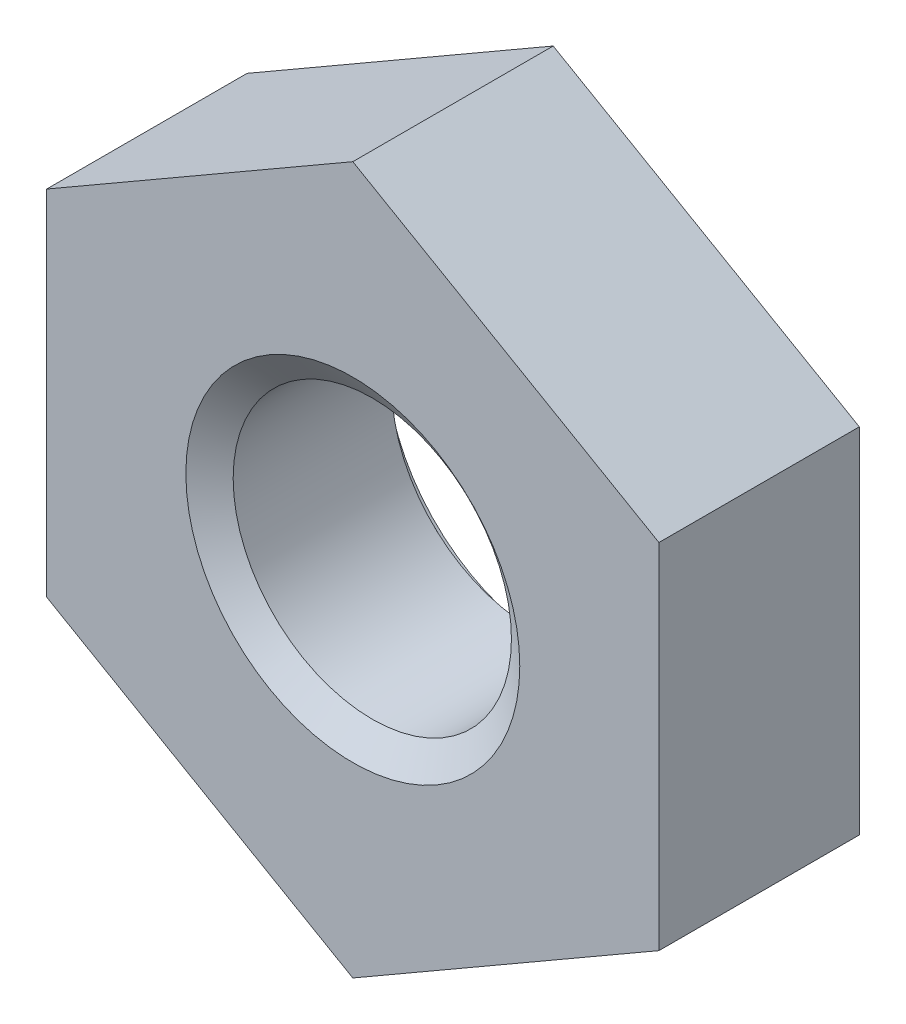
ISO-10303-21;
HEADER;
FILE_DESCRIPTION(('STEP AP214'),'2;1');
FILE_NAME('part.step','',(''),(''),'','','');
FILE_SCHEMA(('AUTOMOTIVE_DESIGN { 1 0 10303 214 1 1 1 1 }'));
ENDSEC;
DATA;
#1=APPLICATION_CONTEXT('core data for automotive mechanical design processes');
#2=APPLICATION_PROTOCOL_DEFINITION('international standard','automotive_design',2000,#1);
#3=PRODUCT_CONTEXT('',#1,'mechanical');
#4=PRODUCT('Part','Part','',(#3));
#5=PRODUCT_RELATED_PRODUCT_CATEGORY('part','',(#4));
#6=PRODUCT_DEFINITION_FORMATION('','',#4);
#7=PRODUCT_DEFINITION_CONTEXT('part definition',#1,'design');
#8=PRODUCT_DEFINITION('design','',#6,#7);
#9=PRODUCT_DEFINITION_SHAPE('','',#8);
#10=(LENGTH_UNIT() NAMED_UNIT(*) SI_UNIT(.MILLI.,.METRE.));
#11=(NAMED_UNIT(*) PLANE_ANGLE_UNIT() SI_UNIT($,.RADIAN.));
#12=(NAMED_UNIT(*) SI_UNIT($,.STERADIAN.) SOLID_ANGLE_UNIT());
#13=UNCERTAINTY_MEASURE_WITH_UNIT(LENGTH_MEASURE(1.E-05),#10,'distance_accuracy_value','');
#14=(GEOMETRIC_REPRESENTATION_CONTEXT(3) GLOBAL_UNCERTAINTY_ASSIGNED_CONTEXT((#13)) GLOBAL_UNIT_ASSIGNED_CONTEXT((#10,
#11,#12)) REPRESENTATION_CONTEXT('',''));
#15=CARTESIAN_POINT('',(0.,0.,0.));
#16=DIRECTION('',(0.,0.,1.));
#17=DIRECTION('',(1.,0.,0.));
#18=AXIS2_PLACEMENT_3D('',#15,#16,#17);
#19=CARTESIAN_POINT('',(0.,0.,-1.8));
#20=DIRECTION('',(0.,0.,1.));
#21=DIRECTION('',(1.,0.,0.));
#22=AXIS2_PLACEMENT_3D('',#19,#20,#21);
#23=CYLINDRICAL_SURFACE('',#22,1.25);
#24=CARTESIAN_POINT('',(0.,0.,-0.175051884552429));
#25=DIRECTION('',(0.,0.,1.));
#26=DIRECTION('',(1.,0.,0.));
#27=AXIS2_PLACEMENT_3D('',#24,#25,#26);
#28=CIRCLE('',#27,1.25);
#29=CARTESIAN_POINT('',(1.25,0.,-0.175051884552429));
#30=VERTEX_POINT('',#29);
#31=EDGE_CURVE('E126',#30,#30,#28,.F.);
#32=ORIENTED_EDGE('',*,*,#31,.F.);
#33=EDGE_LOOP('',(#32));
#34=FACE_BOUND('',#33,.T.);
#35=CARTESIAN_POINT('',(0.,0.,-1.59954811544757));
#36=DIRECTION('',(0.,0.,-1.));
#37=DIRECTION('',(-1.,0.,0.));
#38=AXIS2_PLACEMENT_3D('',#35,#36,#37);
#39=CIRCLE('',#38,1.25);
#40=CARTESIAN_POINT('',(-1.25,0.,-1.59954811544757));
#41=VERTEX_POINT('',#40);
#42=EDGE_CURVE('E39',#41,#41,#39,.F.);
#43=ORIENTED_EDGE('',*,*,#42,.F.);
#44=EDGE_LOOP('',(#43));
#45=FACE_BOUND('',#44,.T.);
#46=ADVANCED_FACE('F35',(#34,#45),#23,.F.);
#47=CARTESIAN_POINT('',(0.,3.17542648054294,-1.8));
#48=DIRECTION('',(-0.500000000000001,0.866025403784438,0.));
#49=DIRECTION('',(-0.866025403784438,-0.500000000000001,0.));
#50=AXIS2_PLACEMENT_3D('',#47,#48,#49);
#51=PLANE('',#50);
#52=DIRECTION('',(-0.866025403784438,-0.500000000000001,0.));
#53=VECTOR('',#52,1.);
#54=CARTESIAN_POINT('',(0.,3.17542648054294,0.));
#55=LINE('',#54,#53);
#56=CARTESIAN_POINT('',(0.,3.17542648054294,0.));
#57=VERTEX_POINT('',#56);
#58=CARTESIAN_POINT('',(-2.75,1.58771324027147,0.));
#59=VERTEX_POINT('',#58);
#60=EDGE_CURVE('E122',#57,#59,#55,.T.);
#61=ORIENTED_EDGE('',*,*,#60,.F.);
#62=DIRECTION('',(0.,0.,1.));
#63=VECTOR('',#62,1.);
#64=CARTESIAN_POINT('',(0.,3.17542648054294,-1.8));
#65=LINE('',#64,#63);
#66=CARTESIAN_POINT('',(0.,3.17542648054294,-1.8));
#67=VERTEX_POINT('',#66);
#68=EDGE_CURVE('E11',#67,#57,#65,.T.);
#69=ORIENTED_EDGE('',*,*,#68,.F.);
#70=DIRECTION('',(-0.866025403784438,-0.500000000000001,0.));
#71=VECTOR('',#70,1.);
#72=CARTESIAN_POINT('',(0.,3.17542648054294,-1.8));
#73=LINE('',#72,#71);
#74=CARTESIAN_POINT('',(-2.75,1.58771324027147,-1.8));
#75=VERTEX_POINT('',#74);
#76=EDGE_CURVE('E137',#67,#75,#73,.T.);
#77=ORIENTED_EDGE('',*,*,#76,.T.);
#78=DIRECTION('',(0.,0.,1.));
#79=VECTOR('',#78,1.);
#80=CARTESIAN_POINT('',(-2.75,1.58771324027147,-1.8));
#81=LINE('',#80,#79);
#82=EDGE_CURVE('E86',#75,#59,#81,.T.);
#83=ORIENTED_EDGE('',*,*,#82,.T.);
#84=EDGE_LOOP('',(#61,#69,#77,#83));
#85=FACE_BOUND('',#84,.T.);
#86=ADVANCED_FACE('F37',(#85),#51,.T.);
#87=CARTESIAN_POINT('',(2.75,1.58771324027147,-1.8));
#88=DIRECTION('',(0.500000000000001,0.866025403784438,0.));
#89=DIRECTION('',(-0.866025403784438,0.500000000000001,0.));
#90=AXIS2_PLACEMENT_3D('',#87,#88,#89);
#91=PLANE('',#90);
#92=DIRECTION('',(-0.866025403784438,0.500000000000001,0.));
#93=VECTOR('',#92,1.);
#94=CARTESIAN_POINT('',(2.75,1.58771324027147,0.));
#95=LINE('',#94,#93);
#96=CARTESIAN_POINT('',(2.75,1.58771324027147,0.));
#97=VERTEX_POINT('',#96);
#98=EDGE_CURVE('E135',#97,#57,#95,.T.);
#99=ORIENTED_EDGE('',*,*,#98,.F.);
#100=DIRECTION('',(0.,0.,1.));
#101=VECTOR('',#100,1.);
#102=CARTESIAN_POINT('',(2.75,1.58771324027147,-1.8));
#103=LINE('',#102,#101);
#104=CARTESIAN_POINT('',(2.75,1.58771324027147,-1.8));
#105=VERTEX_POINT('',#104);
#106=EDGE_CURVE('E45',#105,#97,#103,.T.);
#107=ORIENTED_EDGE('',*,*,#106,.F.);
#108=DIRECTION('',(-0.866025403784438,0.500000000000001,0.));
#109=VECTOR('',#108,1.);
#110=CARTESIAN_POINT('',(2.75,1.58771324027147,-1.8));
#111=LINE('',#110,#109);
#112=EDGE_CURVE('E104',#105,#67,#111,.T.);
#113=ORIENTED_EDGE('',*,*,#112,.T.);
#114=ORIENTED_EDGE('',*,*,#68,.T.);
#115=EDGE_LOOP('',(#99,#107,#113,#114));
#116=FACE_BOUND('',#115,.T.);
#117=ADVANCED_FACE('F163',(#116),#91,.T.);
#118=CARTESIAN_POINT('',(2.75,1.58771324027147,-1.8));
#119=DIRECTION('',(-1.,0.,0.));
#120=DIRECTION('',(0.,0.,1.));
#121=AXIS2_PLACEMENT_3D('',#118,#119,#120);
#122=PLANE('',#121);
#123=DIRECTION('',(0.,-1.,0.));
#124=VECTOR('',#123,1.);
#125=CARTESIAN_POINT('',(2.75,1.58771324027147,0.));
#126=LINE('',#125,#124);
#127=CARTESIAN_POINT('',(2.75,-1.58771324027148,0.));
#128=VERTEX_POINT('',#127);
#129=EDGE_CURVE('E108',#97,#128,#126,.T.);
#130=ORIENTED_EDGE('',*,*,#129,.T.);
#131=DIRECTION('',(0.,0.,1.));
#132=VECTOR('',#131,1.);
#133=CARTESIAN_POINT('',(2.75,-1.58771324027148,-1.8));
#134=LINE('',#133,#132);
#135=CARTESIAN_POINT('',(2.75,-1.58771324027148,-1.8));
#136=VERTEX_POINT('',#135);
#137=EDGE_CURVE('E106',#136,#128,#134,.T.);
#138=ORIENTED_EDGE('',*,*,#137,.F.);
#139=DIRECTION('',(0.,-1.,0.));
#140=VECTOR('',#139,1.);
#141=CARTESIAN_POINT('',(2.75,1.58771324027147,-1.8));
#142=LINE('',#141,#140);
#143=EDGE_CURVE('E97',#105,#136,#142,.T.);
#144=ORIENTED_EDGE('',*,*,#143,.F.);
#145=ORIENTED_EDGE('',*,*,#106,.T.);
#146=EDGE_LOOP('',(#130,#138,#144,#145));
#147=FACE_BOUND('',#146,.T.);
#148=ADVANCED_FACE('F107',(#147),#122,.F.);
#149=CARTESIAN_POINT('',(0.,-3.17542648054295,-1.8));
#150=DIRECTION('',(0.500000000000001,-0.866025403784438,0.));
#151=DIRECTION('',(0.866025403784438,0.500000000000001,0.));
#152=AXIS2_PLACEMENT_3D('',#149,#150,#151);
#153=PLANE('',#152);
#154=DIRECTION('',(0.866025403784438,0.500000000000001,0.));
#155=VECTOR('',#154,1.);
#156=CARTESIAN_POINT('',(0.,-3.17542648054295,0.));
#157=LINE('',#156,#155);
#158=CARTESIAN_POINT('',(0.,-3.17542648054295,0.));
#159=VERTEX_POINT('',#158);
#160=EDGE_CURVE('E132',#159,#128,#157,.T.);
#161=ORIENTED_EDGE('',*,*,#160,.F.);
#162=DIRECTION('',(0.,0.,1.));
#163=VECTOR('',#162,1.);
#164=CARTESIAN_POINT('',(0.,-3.17542648054295,-1.8));
#165=LINE('',#164,#163);
#166=CARTESIAN_POINT('',(0.,-3.17542648054295,-1.8));
#167=VERTEX_POINT('',#166);
#168=EDGE_CURVE('E112',#167,#159,#165,.T.);
#169=ORIENTED_EDGE('',*,*,#168,.F.);
#170=DIRECTION('',(0.866025403784438,0.500000000000001,0.));
#171=VECTOR('',#170,1.);
#172=CARTESIAN_POINT('',(0.,-3.17542648054295,-1.8));
#173=LINE('',#172,#171);
#174=EDGE_CURVE('E102',#167,#136,#173,.T.);
#175=ORIENTED_EDGE('',*,*,#174,.T.);
#176=ORIENTED_EDGE('',*,*,#137,.T.);
#177=EDGE_LOOP('',(#161,#169,#175,#176));
#178=FACE_BOUND('',#177,.T.);
#179=ADVANCED_FACE('F114',(#178),#153,.T.);
#180=CARTESIAN_POINT('',(-2.75,-1.58771324027148,-1.8));
#181=DIRECTION('',(-0.500000000000001,-0.866025403784438,0.));
#182=DIRECTION('',(0.866025403784438,-0.500000000000001,0.));
#183=AXIS2_PLACEMENT_3D('',#180,#181,#182);
#184=PLANE('',#183);
#185=DIRECTION('',(0.866025403784438,-0.500000000000001,0.));
#186=VECTOR('',#185,1.);
#187=CARTESIAN_POINT('',(-2.75,-1.58771324027148,0.));
#188=LINE('',#187,#186);
#189=CARTESIAN_POINT('',(-2.75,-1.58771324027148,0.));
#190=VERTEX_POINT('',#189);
#191=EDGE_CURVE('E129',#190,#159,#188,.T.);
#192=ORIENTED_EDGE('',*,*,#191,.F.);
#193=DIRECTION('',(0.,0.,1.));
#194=VECTOR('',#193,1.);
#195=CARTESIAN_POINT('',(-2.75,-1.58771324027148,-1.8));
#196=LINE('',#195,#194);
#197=CARTESIAN_POINT('',(-2.75,-1.58771324027148,-1.8));
#198=VERTEX_POINT('',#197);
#199=EDGE_CURVE('E141',#198,#190,#196,.T.);
#200=ORIENTED_EDGE('',*,*,#199,.F.);
#201=DIRECTION('',(0.866025403784438,-0.500000000000001,0.));
#202=VECTOR('',#201,1.);
#203=CARTESIAN_POINT('',(-2.75,-1.58771324027148,-1.8));
#204=LINE('',#203,#202);
#205=EDGE_CURVE('E115',#198,#167,#204,.T.);
#206=ORIENTED_EDGE('',*,*,#205,.T.);
#207=ORIENTED_EDGE('',*,*,#168,.T.);
#208=EDGE_LOOP('',(#192,#200,#206,#207));
#209=FACE_BOUND('',#208,.T.);
#210=ADVANCED_FACE('F240',(#209),#184,.T.);
#211=CARTESIAN_POINT('',(-2.75,1.58771324027147,-1.8));
#212=DIRECTION('',(-1.,0.,0.));
#213=DIRECTION('',(0.,0.,1.));
#214=AXIS2_PLACEMENT_3D('',#211,#212,#213);
#215=PLANE('',#214);
#216=DIRECTION('',(0.,-1.,0.));
#217=VECTOR('',#216,1.);
#218=CARTESIAN_POINT('',(-2.75,1.58771324027147,0.));
#219=LINE('',#218,#217);
#220=EDGE_CURVE('E125',#59,#190,#219,.T.);
#221=ORIENTED_EDGE('',*,*,#220,.F.);
#222=ORIENTED_EDGE('',*,*,#82,.F.);
#223=DIRECTION('',(0.,-1.,0.));
#224=VECTOR('',#223,1.);
#225=CARTESIAN_POINT('',(-2.75,1.58771324027147,-1.8));
#226=LINE('',#225,#224);
#227=EDGE_CURVE('E117',#75,#198,#226,.T.);
#228=ORIENTED_EDGE('',*,*,#227,.T.);
#229=ORIENTED_EDGE('',*,*,#199,.T.);
#230=EDGE_LOOP('',(#221,#222,#228,#229));
#231=FACE_BOUND('',#230,.T.);
#232=ADVANCED_FACE('F159',(#231),#215,.T.);
#233=CARTESIAN_POINT('',(-5.49999999999999,0.,-1.8));
#234=DIRECTION('',(0.,0.,1.));
#235=DIRECTION('',(1.,0.,0.));
#236=AXIS2_PLACEMENT_3D('',#233,#234,#235);
#237=PLANE('',#236);
#238=CARTESIAN_POINT('',(0.,0.,-1.8));
#239=DIRECTION('',(0.,0.,1.));
#240=DIRECTION('',(1.,0.,0.));
#241=AXIS2_PLACEMENT_3D('',#238,#239,#240);
#242=CIRCLE('',#241,1.5);
#243=CARTESIAN_POINT('',(1.5,0.,-1.8));
#244=VERTEX_POINT('',#243);
#245=EDGE_CURVE('E146',#244,#244,#242,.F.);
#246=ORIENTED_EDGE('',*,*,#245,.F.);
#247=EDGE_LOOP('',(#246));
#248=FACE_BOUND('',#247,.T.);
#249=ORIENTED_EDGE('',*,*,#76,.F.);
#250=ORIENTED_EDGE('',*,*,#112,.F.);
#251=ORIENTED_EDGE('',*,*,#143,.T.);
#252=ORIENTED_EDGE('',*,*,#174,.F.);
#253=ORIENTED_EDGE('',*,*,#205,.F.);
#254=ORIENTED_EDGE('',*,*,#227,.F.);
#255=EDGE_LOOP('',(#249,#250,#251,#252,#253,#254));
#256=FACE_BOUND('',#255,.T.);
#257=ADVANCED_FACE('F99',(#248,#256),#237,.F.);
#258=CARTESIAN_POINT('',(-5.49999999999999,0.,0.));
#259=DIRECTION('',(0.,0.,1.));
#260=DIRECTION('',(1.,0.,0.));
#261=AXIS2_PLACEMENT_3D('',#258,#259,#260);
#262=PLANE('',#261);
#263=CARTESIAN_POINT('',(0.,0.,0.));
#264=DIRECTION('',(0.,0.,1.));
#265=DIRECTION('',(1.,0.,0.));
#266=AXIS2_PLACEMENT_3D('',#263,#264,#265);
#267=CIRCLE('',#266,1.5);
#268=CARTESIAN_POINT('',(1.5,0.,0.));
#269=VERTEX_POINT('',#268);
#270=EDGE_CURVE('E145',#269,#269,#267,.T.);
#271=ORIENTED_EDGE('',*,*,#270,.F.);
#272=EDGE_LOOP('',(#271));
#273=FACE_BOUND('',#272,.T.);
#274=ORIENTED_EDGE('',*,*,#60,.T.);
#275=ORIENTED_EDGE('',*,*,#220,.T.);
#276=ORIENTED_EDGE('',*,*,#191,.T.);
#277=ORIENTED_EDGE('',*,*,#160,.T.);
#278=ORIENTED_EDGE('',*,*,#129,.F.);
#279=ORIENTED_EDGE('',*,*,#98,.T.);
#280=EDGE_LOOP('',(#274,#275,#276,#277,#278,#279));
#281=FACE_BOUND('',#280,.T.);
#282=ADVANCED_FACE('F162',(#273,#281),#262,.T.);
#283=CARTESIAN_POINT('',(0.,0.,-0.192557073007672));
#284=DIRECTION('',(0.,0.,1.));
#285=DIRECTION('',(1.,0.,0.));
#286=AXIS2_PLACEMENT_3D('',#283,#284,#285);
#287=CONICAL_SURFACE('',#286,1.225,0.959931088596876);
#288=ORIENTED_EDGE('',*,*,#270,.T.);
#289=EDGE_LOOP('',(#288));
#290=FACE_BOUND('',#289,.T.);
#291=ORIENTED_EDGE('',*,*,#31,.T.);
#292=EDGE_LOOP('',(#291));
#293=FACE_BOUND('',#292,.T.);
#294=ADVANCED_FACE('F181',(#290,#293),#287,.F.);
#295=CARTESIAN_POINT('',(0.,0.,-1.7746));
#296=DIRECTION('',(0.,0.,-1.));
#297=DIRECTION('',(-1.,0.,0.));
#298=AXIS2_PLACEMENT_3D('',#295,#296,#297);
#299=CONICAL_SURFACE('',#298,1.5,0.959931088596876);
#300=CARTESIAN_POINT('',(0.,0.,-1.7746));
#301=DIRECTION('',(0.,0.,1.));
#302=DIRECTION('',(1.,0.,0.));
#303=AXIS2_PLACEMENT_3D('',#300,#301,#302);
#304=CIRCLE('',#303,1.5);
#305=CARTESIAN_POINT('',(1.5,0.,-1.7746));
#306=VERTEX_POINT('',#305);
#307=EDGE_CURVE('E148',#306,#306,#304,.T.);
#308=ORIENTED_EDGE('',*,*,#307,.F.);
#309=EDGE_LOOP('',(#308));
#310=FACE_BOUND('',#309,.T.);
#311=ORIENTED_EDGE('',*,*,#42,.T.);
#312=EDGE_LOOP('',(#311));
#313=FACE_BOUND('',#312,.T.);
#314=ADVANCED_FACE('F190',(#310,#313),#299,.F.);
#315=CARTESIAN_POINT('',(0.,0.,-25.0375057290932));
#316=DIRECTION('',(0.,0.,1.));
#317=DIRECTION('',(1.,0.,0.));
#318=AXIS2_PLACEMENT_3D('',#315,#316,#317);
#319=CYLINDRICAL_SURFACE('',#318,1.5);
#320=ORIENTED_EDGE('',*,*,#307,.T.);
#321=EDGE_LOOP('',(#320));
#322=FACE_BOUND('',#321,.T.);
#323=ORIENTED_EDGE('',*,*,#245,.T.);
#324=EDGE_LOOP('',(#323));
#325=FACE_BOUND('',#324,.T.);
#326=ADVANCED_FACE('F197',(#322,#325),#319,.F.);
#327=CLOSED_SHELL('',(#46,#86,#117,#148,#179,#210,#232,#257,#282,#294,#314,#326));
#328=MANIFOLD_SOLID_BREP('B2',#327);
#329=ADVANCED_BREP_SHAPE_REPRESENTATION('',(#18,#328),#14);
#330=SHAPE_DEFINITION_REPRESENTATION(#9,#329);
ENDSEC;
END-ISO-10303-21;
